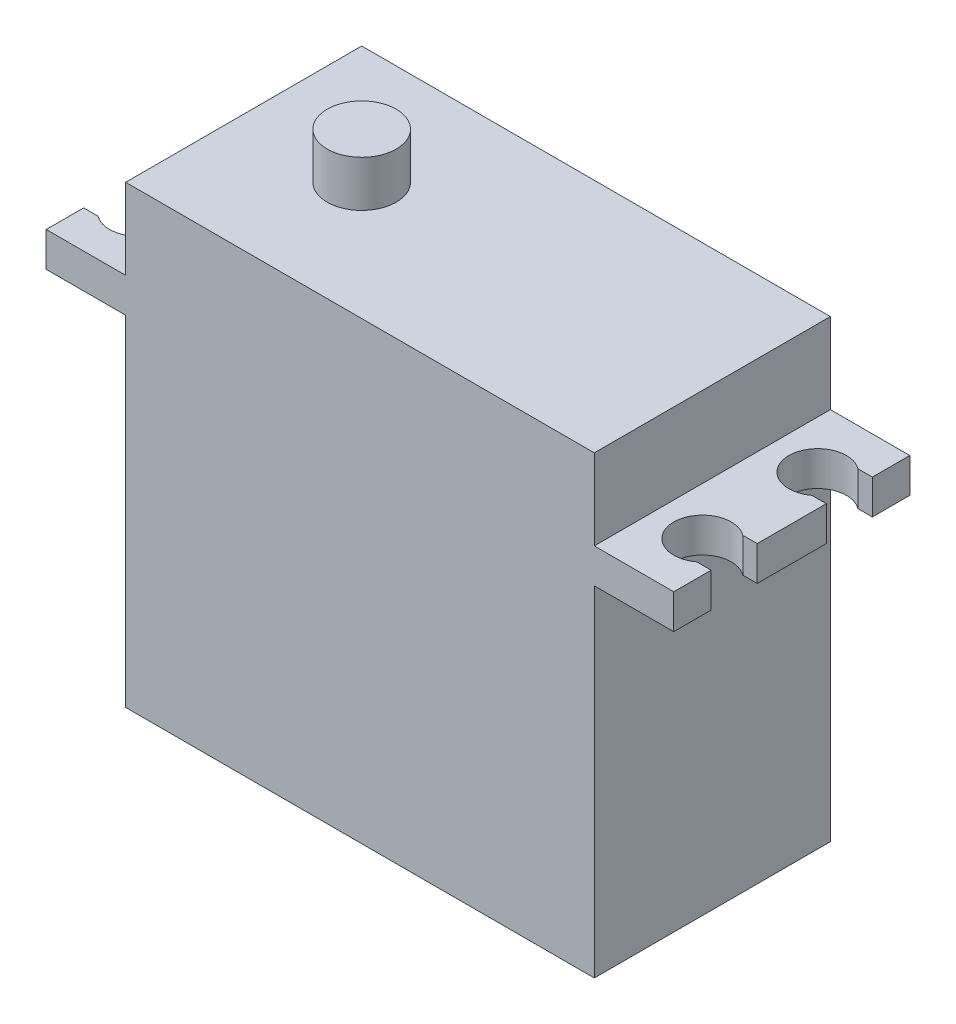
ISO-10303-21;
HEADER;
FILE_DESCRIPTION(('STEP AP214'),'2;1');
FILE_NAME('part.step','',(''),(''),'','','');
FILE_SCHEMA(('AUTOMOTIVE_DESIGN { 1 0 10303 214 1 1 1 1 }'));
ENDSEC;
DATA;
#1=APPLICATION_CONTEXT('core data for automotive mechanical design processes');
#2=APPLICATION_PROTOCOL_DEFINITION('international standard','automotive_design',2000,#1);
#3=PRODUCT_CONTEXT('',#1,'mechanical');
#4=PRODUCT('Part','Part','',(#3));
#5=PRODUCT_RELATED_PRODUCT_CATEGORY('part','',(#4));
#6=PRODUCT_DEFINITION_FORMATION('','',#4);
#7=PRODUCT_DEFINITION_CONTEXT('part definition',#1,'design');
#8=PRODUCT_DEFINITION('design','',#6,#7);
#9=PRODUCT_DEFINITION_SHAPE('','',#8);
#10=(LENGTH_UNIT() NAMED_UNIT(*) SI_UNIT(.MILLI.,.METRE.));
#11=(NAMED_UNIT(*) PLANE_ANGLE_UNIT() SI_UNIT($,.RADIAN.));
#12=(NAMED_UNIT(*) SI_UNIT($,.STERADIAN.) SOLID_ANGLE_UNIT());
#13=UNCERTAINTY_MEASURE_WITH_UNIT(LENGTH_MEASURE(1.E-05),#10,'distance_accuracy_value','');
#14=(GEOMETRIC_REPRESENTATION_CONTEXT(3) GLOBAL_UNCERTAINTY_ASSIGNED_CONTEXT((#13)) GLOBAL_UNIT_ASSIGNED_CONTEXT((#10,
#11,#12)) REPRESENTATION_CONTEXT('',''));
#15=CARTESIAN_POINT('',(0.,0.,0.));
#16=DIRECTION('',(0.,0.,1.));
#17=DIRECTION('',(1.,0.,0.));
#18=AXIS2_PLACEMENT_3D('',#15,#16,#17);
#19=CARTESIAN_POINT('',(47.6,32.5,-20.5));
#20=DIRECTION('',(-1.,0.,0.));
#21=DIRECTION('',(0.,0.,1.));
#22=AXIS2_PLACEMENT_3D('',#19,#20,#21);
#23=PLANE('',#22);
#24=DIRECTION('',(0.,0.,-1.));
#25=VECTOR('',#24,1.);
#26=CARTESIAN_POINT('',(47.6,29.5,-20.5));
#27=LINE('',#26,#25);
#28=CARTESIAN_POINT('',(47.6,29.5,-7.25000000000004));
#29=VERTEX_POINT('',#28);
#30=CARTESIAN_POINT('',(47.6,29.5,-13.25));
#31=VERTEX_POINT('',#30);
#32=EDGE_CURVE('E235',#29,#31,#27,.T.);
#33=ORIENTED_EDGE('',*,*,#32,.T.);
#34=DIRECTION('',(0.,-1.,0.));
#35=VECTOR('',#34,1.);
#36=CARTESIAN_POINT('',(47.6,43.5,-13.25));
#37=LINE('',#36,#35);
#38=CARTESIAN_POINT('',(47.6,32.5,-13.25));
#39=VERTEX_POINT('',#38);
#40=EDGE_CURVE('E219',#39,#31,#37,.T.);
#41=ORIENTED_EDGE('',*,*,#40,.F.);
#42=DIRECTION('',(0.,0.,-1.));
#43=VECTOR('',#42,1.);
#44=CARTESIAN_POINT('',(47.6,32.5,-20.5));
#45=LINE('',#44,#43);
#46=CARTESIAN_POINT('',(47.6,32.5,-7.25000000000004));
#47=VERTEX_POINT('',#46);
#48=EDGE_CURVE('E367',#47,#39,#45,.T.);
#49=ORIENTED_EDGE('',*,*,#48,.F.);
#50=DIRECTION('',(0.,-1.,0.));
#51=VECTOR('',#50,1.);
#52=CARTESIAN_POINT('',(47.6,43.5,-7.25000000000004));
#53=LINE('',#52,#51);
#54=EDGE_CURVE('E242',#47,#29,#53,.T.);
#55=ORIENTED_EDGE('',*,*,#54,.T.);
#56=EDGE_LOOP('',(#33,#41,#49,#55));
#57=FACE_BOUND('',#56,.T.);
#58=ADVANCED_FACE('F34',(#57),#23,.F.);
#59=CARTESIAN_POINT('',(47.6,32.5,-17.25));
#60=VERTEX_POINT('',#59);
#61=CARTESIAN_POINT('',(47.6,32.5,-20.5));
#62=VERTEX_POINT('',#61);
#63=EDGE_CURVE('E364',#60,#62,#45,.T.);
#64=ORIENTED_EDGE('',*,*,#63,.F.);
#65=DIRECTION('',(0.,-1.,0.));
#66=VECTOR('',#65,1.);
#67=CARTESIAN_POINT('',(47.6,43.5,-17.25));
#68=LINE('',#67,#66);
#69=CARTESIAN_POINT('',(47.6,29.5,-17.25));
#70=VERTEX_POINT('',#69);
#71=EDGE_CURVE('E228',#60,#70,#68,.T.);
#72=ORIENTED_EDGE('',*,*,#71,.T.);
#73=CARTESIAN_POINT('',(47.6,29.5,-20.5));
#74=VERTEX_POINT('',#73);
#75=EDGE_CURVE('E244',#70,#74,#27,.T.);
#76=ORIENTED_EDGE('',*,*,#75,.T.);
#77=DIRECTION('',(0.,-1.,0.));
#78=VECTOR('',#77,1.);
#79=CARTESIAN_POINT('',(47.6,32.5,-20.5));
#80=LINE('',#79,#78);
#81=EDGE_CURVE('E259',#62,#74,#80,.T.);
#82=ORIENTED_EDGE('',*,*,#81,.F.);
#83=EDGE_LOOP('',(#64,#72,#76,#82));
#84=FACE_BOUND('',#83,.T.);
#85=ADVANCED_FACE('F459',(#84),#23,.F.);
#86=DIRECTION('',(0.,-1.,0.));
#87=VECTOR('',#86,1.);
#88=CARTESIAN_POINT('',(47.6,43.5,-3.25000000000004));
#89=LINE('',#88,#87);
#90=CARTESIAN_POINT('',(47.6,32.5,-3.25000000000004));
#91=VERTEX_POINT('',#90);
#92=CARTESIAN_POINT('',(47.6,29.5,-3.25000000000004));
#93=VERTEX_POINT('',#92);
#94=EDGE_CURVE('E57',#91,#93,#89,.T.);
#95=ORIENTED_EDGE('',*,*,#94,.F.);
#96=CARTESIAN_POINT('',(47.6,32.5,0.));
#97=VERTEX_POINT('',#96);
#98=EDGE_CURVE('E369',#97,#91,#45,.T.);
#99=ORIENTED_EDGE('',*,*,#98,.F.);
#100=DIRECTION('',(0.,-1.,0.));
#101=VECTOR('',#100,1.);
#102=CARTESIAN_POINT('',(47.6,32.5,0.));
#103=LINE('',#102,#101);
#104=CARTESIAN_POINT('',(47.6,29.5,0.));
#105=VERTEX_POINT('',#104);
#106=EDGE_CURVE('E263',#97,#105,#103,.T.);
#107=ORIENTED_EDGE('',*,*,#106,.T.);
#108=EDGE_CURVE('E243',#105,#93,#27,.T.);
#109=ORIENTED_EDGE('',*,*,#108,.T.);
#110=EDGE_LOOP('',(#95,#99,#107,#109));
#111=FACE_BOUND('',#110,.T.);
#112=ADVANCED_FACE('F461',(#111),#23,.F.);
#113=CARTESIAN_POINT('',(0.,32.5,0.));
#114=DIRECTION('',(0.,1.,0.));
#115=DIRECTION('',(0.,0.,1.));
#116=AXIS2_PLACEMENT_3D('',#113,#114,#115);
#117=PLANE('',#116);
#118=DIRECTION('',(1.,0.,0.));
#119=VECTOR('',#118,1.);
#120=CARTESIAN_POINT('',(0.,32.5,-13.25));
#121=LINE('',#120,#119);
#122=CARTESIAN_POINT('',(46.35,32.5,-13.25));
#123=VERTEX_POINT('',#122);
#124=EDGE_CURVE('E222',#123,#39,#121,.T.);
#125=ORIENTED_EDGE('',*,*,#124,.F.);
#126=CARTESIAN_POINT('',(44.85,32.5,-15.25));
#127=DIRECTION('',(0.,1.,0.));
#128=DIRECTION('',(0.,0.,1.));
#129=AXIS2_PLACEMENT_3D('',#126,#127,#128);
#130=CIRCLE('',#129,2.5);
#131=CARTESIAN_POINT('',(46.35,32.5,-17.25));
#132=VERTEX_POINT('',#131);
#133=EDGE_CURVE('E227',#132,#123,#130,.T.);
#134=ORIENTED_EDGE('',*,*,#133,.F.);
#135=DIRECTION('',(-1.,0.,0.));
#136=VECTOR('',#135,1.);
#137=CARTESIAN_POINT('',(0.,32.5,-17.25));
#138=LINE('',#137,#136);
#139=EDGE_CURVE('E517',#60,#132,#138,.T.);
#140=ORIENTED_EDGE('',*,*,#139,.F.);
#141=ORIENTED_EDGE('',*,*,#63,.T.);
#142=DIRECTION('',(-1.,0.,0.));
#143=VECTOR('',#142,1.);
#144=CARTESIAN_POINT('',(-6.90000000000001,32.5,-20.5));
#145=LINE('',#144,#143);
#146=CARTESIAN_POINT('',(40.7,32.5,-20.5));
#147=VERTEX_POINT('',#146);
#148=EDGE_CURVE('E260',#62,#147,#145,.T.);
#149=ORIENTED_EDGE('',*,*,#148,.T.);
#150=DIRECTION('',(0.,0.,-1.));
#151=VECTOR('',#150,1.);
#152=CARTESIAN_POINT('',(40.7,32.5,0.));
#153=LINE('',#152,#151);
#154=CARTESIAN_POINT('',(40.7,32.5,0.));
#155=VERTEX_POINT('',#154);
#156=EDGE_CURVE('E275',#155,#147,#153,.T.);
#157=ORIENTED_EDGE('',*,*,#156,.F.);
#158=DIRECTION('',(1.,0.,0.));
#159=VECTOR('',#158,1.);
#160=CARTESIAN_POINT('',(-6.9,32.5,0.));
#161=LINE('',#160,#159);
#162=EDGE_CURVE('E365',#155,#97,#161,.T.);
#163=ORIENTED_EDGE('',*,*,#162,.T.);
#164=ORIENTED_EDGE('',*,*,#98,.T.);
#165=DIRECTION('',(-1.,0.,0.));
#166=VECTOR('',#165,1.);
#167=CARTESIAN_POINT('',(0.,32.5,-3.24999999999997));
#168=LINE('',#167,#166);
#169=CARTESIAN_POINT('',(46.35,32.5,-3.25000000000003));
#170=VERTEX_POINT('',#169);
#171=EDGE_CURVE('E481',#91,#170,#168,.T.);
#172=ORIENTED_EDGE('',*,*,#171,.T.);
#173=CARTESIAN_POINT('',(44.85,32.5,-5.25000000000003));
#174=DIRECTION('',(0.,1.,0.));
#175=DIRECTION('',(0.,0.,1.));
#176=AXIS2_PLACEMENT_3D('',#173,#174,#175);
#177=CIRCLE('',#176,2.5);
#178=CARTESIAN_POINT('',(46.35,32.5,-7.25000000000003));
#179=VERTEX_POINT('',#178);
#180=EDGE_CURVE('E441',#170,#179,#177,.F.);
#181=ORIENTED_EDGE('',*,*,#180,.T.);
#182=DIRECTION('',(1.,0.,0.));
#183=VECTOR('',#182,1.);
#184=CARTESIAN_POINT('',(0.,32.5,-7.24999999999997));
#185=LINE('',#184,#183);
#186=EDGE_CURVE('E437',#179,#47,#185,.T.);
#187=ORIENTED_EDGE('',*,*,#186,.T.);
#188=ORIENTED_EDGE('',*,*,#48,.T.);
#189=EDGE_LOOP('',(#125,#134,#140,#141,#149,#157,#163,#164,#172,#181,#187,#188));
#190=FACE_BOUND('',#189,.T.);
#191=ADVANCED_FACE('F469',(#190),#117,.T.);
#192=CARTESIAN_POINT('',(0.,29.5,0.));
#193=DIRECTION('',(0.,1.,0.));
#194=DIRECTION('',(0.,0.,1.));
#195=AXIS2_PLACEMENT_3D('',#192,#193,#194);
#196=PLANE('',#195);
#197=CARTESIAN_POINT('',(44.85,29.5,-15.25));
#198=DIRECTION('',(0.,-1.,0.));
#199=DIRECTION('',(0.,0.,1.));
#200=AXIS2_PLACEMENT_3D('',#197,#198,#199);
#201=CIRCLE('',#200,2.5);
#202=CARTESIAN_POINT('',(46.35,29.5,-13.25));
#203=VERTEX_POINT('',#202);
#204=CARTESIAN_POINT('',(46.35,29.5,-17.25));
#205=VERTEX_POINT('',#204);
#206=EDGE_CURVE('E238',#203,#205,#201,.T.);
#207=ORIENTED_EDGE('',*,*,#206,.F.);
#208=DIRECTION('',(-1.,0.,0.));
#209=VECTOR('',#208,1.);
#210=CARTESIAN_POINT('',(47.6,29.5,-13.25));
#211=LINE('',#210,#209);
#212=EDGE_CURVE('E49',#31,#203,#211,.T.);
#213=ORIENTED_EDGE('',*,*,#212,.F.);
#214=ORIENTED_EDGE('',*,*,#32,.F.);
#215=DIRECTION('',(-1.,0.,0.));
#216=VECTOR('',#215,1.);
#217=CARTESIAN_POINT('',(47.6,29.5,-7.25000000000004));
#218=LINE('',#217,#216);
#219=CARTESIAN_POINT('',(46.35,29.5,-7.25000000000003));
#220=VERTEX_POINT('',#219);
#221=EDGE_CURVE('E491',#29,#220,#218,.T.);
#222=ORIENTED_EDGE('',*,*,#221,.T.);
#223=CARTESIAN_POINT('',(44.85,29.5,-5.25000000000003));
#224=DIRECTION('',(0.,1.,0.));
#225=DIRECTION('',(0.,0.,-1.));
#226=AXIS2_PLACEMENT_3D('',#223,#224,#225);
#227=CIRCLE('',#226,2.5);
#228=CARTESIAN_POINT('',(46.35,29.5,-3.25000000000003));
#229=VERTEX_POINT('',#228);
#230=EDGE_CURVE('E487',#220,#229,#227,.T.);
#231=ORIENTED_EDGE('',*,*,#230,.T.);
#232=DIRECTION('',(1.,0.,0.));
#233=VECTOR('',#232,1.);
#234=CARTESIAN_POINT('',(46.35,29.5,-3.25000000000003));
#235=LINE('',#234,#233);
#236=EDGE_CURVE('E485',#229,#93,#235,.T.);
#237=ORIENTED_EDGE('',*,*,#236,.T.);
#238=ORIENTED_EDGE('',*,*,#108,.F.);
#239=DIRECTION('',(1.,0.,0.));
#240=VECTOR('',#239,1.);
#241=CARTESIAN_POINT('',(-6.9,29.5,0.));
#242=LINE('',#241,#240);
#243=CARTESIAN_POINT('',(40.7,29.5,0.));
#244=VERTEX_POINT('',#243);
#245=EDGE_CURVE('E348',#244,#105,#242,.T.);
#246=ORIENTED_EDGE('',*,*,#245,.F.);
#247=DIRECTION('',(0.,0.,-1.));
#248=VECTOR('',#247,1.);
#249=CARTESIAN_POINT('',(40.7,29.5,0.));
#250=LINE('',#249,#248);
#251=CARTESIAN_POINT('',(40.7,29.5,-20.5));
#252=VERTEX_POINT('',#251);
#253=EDGE_CURVE('E269',#244,#252,#250,.T.);
#254=ORIENTED_EDGE('',*,*,#253,.T.);
#255=DIRECTION('',(-1.,0.,0.));
#256=VECTOR('',#255,1.);
#257=CARTESIAN_POINT('',(-6.90000000000001,29.5,-20.5));
#258=LINE('',#257,#256);
#259=EDGE_CURVE('E252',#74,#252,#258,.T.);
#260=ORIENTED_EDGE('',*,*,#259,.F.);
#261=ORIENTED_EDGE('',*,*,#75,.F.);
#262=DIRECTION('',(1.,0.,0.));
#263=VECTOR('',#262,1.);
#264=CARTESIAN_POINT('',(46.35,29.5,-17.25));
#265=LINE('',#264,#263);
#266=EDGE_CURVE('E239',#205,#70,#265,.T.);
#267=ORIENTED_EDGE('',*,*,#266,.F.);
#268=EDGE_LOOP('',(#207,#213,#214,#222,#231,#237,#238,#246,#254,#260,#261,#267));
#269=FACE_BOUND('',#268,.T.);
#270=ADVANCED_FACE('F233',(#269),#196,.F.);
#271=CARTESIAN_POINT('',(-6.90000000000001,32.5,-20.5));
#272=DIRECTION('',(1.,0.,0.));
#273=DIRECTION('',(0.,0.,-1.));
#274=AXIS2_PLACEMENT_3D('',#271,#272,#273);
#275=PLANE('',#274);
#276=DIRECTION('',(0.,0.,1.));
#277=VECTOR('',#276,1.);
#278=CARTESIAN_POINT('',(-6.90000000000001,29.5,-20.5));
#279=LINE('',#278,#277);
#280=CARTESIAN_POINT('',(-6.90000000000001,29.5,-13.25));
#281=VERTEX_POINT('',#280);
#282=CARTESIAN_POINT('',(-6.90000000000001,29.5,-7.25));
#283=VERTEX_POINT('',#282);
#284=EDGE_CURVE('E339',#281,#283,#279,.T.);
#285=ORIENTED_EDGE('',*,*,#284,.T.);
#286=DIRECTION('',(0.,1.,0.));
#287=VECTOR('',#286,1.);
#288=CARTESIAN_POINT('',(-6.90000000000001,32.5,-7.25));
#289=LINE('',#288,#287);
#290=CARTESIAN_POINT('',(-6.90000000000001,32.5,-7.25));
#291=VERTEX_POINT('',#290);
#292=EDGE_CURVE('E12',#283,#291,#289,.T.);
#293=ORIENTED_EDGE('',*,*,#292,.T.);
#294=DIRECTION('',(0.,0.,1.));
#295=VECTOR('',#294,1.);
#296=CARTESIAN_POINT('',(-6.90000000000001,32.5,-20.5));
#297=LINE('',#296,#295);
#298=CARTESIAN_POINT('',(-6.90000000000001,32.5,-13.25));
#299=VERTEX_POINT('',#298);
#300=EDGE_CURVE('E391',#299,#291,#297,.T.);
#301=ORIENTED_EDGE('',*,*,#300,.F.);
#302=DIRECTION('',(0.,1.,0.));
#303=VECTOR('',#302,1.);
#304=CARTESIAN_POINT('',(-6.90000000000001,32.5,-13.25));
#305=LINE('',#304,#303);
#306=EDGE_CURVE('E322',#281,#299,#305,.T.);
#307=ORIENTED_EDGE('',*,*,#306,.F.);
#308=EDGE_LOOP('',(#285,#293,#301,#307));
#309=FACE_BOUND('',#308,.T.);
#310=ADVANCED_FACE('F427',(#309),#275,.F.);
#311=DIRECTION('',(-1.,0.,0.));
#312=VECTOR('',#311,1.);
#313=CARTESIAN_POINT('',(0.,32.5,-7.25));
#314=LINE('',#313,#312);
#315=CARTESIAN_POINT('',(-5.65000000000002,32.5,-7.25));
#316=VERTEX_POINT('',#315);
#317=EDGE_CURVE('E397',#316,#291,#314,.T.);
#318=ORIENTED_EDGE('',*,*,#317,.F.);
#319=CARTESIAN_POINT('',(-4.15000000000001,32.5,-5.25));
#320=DIRECTION('',(0.,1.,0.));
#321=DIRECTION('',(0.,0.,1.));
#322=AXIS2_PLACEMENT_3D('',#319,#320,#321);
#323=CIRCLE('',#322,2.5);
#324=CARTESIAN_POINT('',(-5.65000000000001,32.5,-3.25));
#325=VERTEX_POINT('',#324);
#326=EDGE_CURVE('E395',#325,#316,#323,.T.);
#327=ORIENTED_EDGE('',*,*,#326,.F.);
#328=DIRECTION('',(1.,0.,0.));
#329=VECTOR('',#328,1.);
#330=CARTESIAN_POINT('',(0.,32.5,-3.25));
#331=LINE('',#330,#329);
#332=CARTESIAN_POINT('',(-6.90000000000001,32.5,-3.25));
#333=VERTEX_POINT('',#332);
#334=EDGE_CURVE('E394',#333,#325,#331,.T.);
#335=ORIENTED_EDGE('',*,*,#334,.F.);
#336=CARTESIAN_POINT('',(-6.9,32.5,0.));
#337=VERTEX_POINT('',#336);
#338=EDGE_CURVE('E255',#333,#337,#297,.T.);
#339=ORIENTED_EDGE('',*,*,#338,.T.);
#340=CARTESIAN_POINT('',(0.,32.5,0.));
#341=VERTEX_POINT('',#340);
#342=EDGE_CURVE('E360',#337,#341,#161,.T.);
#343=ORIENTED_EDGE('',*,*,#342,.T.);
#344=DIRECTION('',(0.,0.,1.));
#345=VECTOR('',#344,1.);
#346=CARTESIAN_POINT('',(0.,32.5,0.));
#347=LINE('',#346,#345);
#348=CARTESIAN_POINT('',(0.,32.5,-20.5));
#349=VERTEX_POINT('',#348);
#350=EDGE_CURVE('E277',#349,#341,#347,.T.);
#351=ORIENTED_EDGE('',*,*,#350,.F.);
#352=CARTESIAN_POINT('',(-6.90000000000001,32.5,-20.5));
#353=VERTEX_POINT('',#352);
#354=EDGE_CURVE('E373',#349,#353,#145,.T.);
#355=ORIENTED_EDGE('',*,*,#354,.T.);
#356=CARTESIAN_POINT('',(-6.90000000000001,32.5,-17.25));
#357=VERTEX_POINT('',#356);
#358=EDGE_CURVE('E370',#353,#357,#297,.T.);
#359=ORIENTED_EDGE('',*,*,#358,.T.);
#360=DIRECTION('',(1.,0.,0.));
#361=VECTOR('',#360,1.);
#362=CARTESIAN_POINT('',(0.,32.5,-17.25));
#363=LINE('',#362,#361);
#364=CARTESIAN_POINT('',(-5.65000000000001,32.5,-17.25));
#365=VERTEX_POINT('',#364);
#366=EDGE_CURVE('E419',#357,#365,#363,.T.);
#367=ORIENTED_EDGE('',*,*,#366,.T.);
#368=CARTESIAN_POINT('',(-4.15000000000001,32.5,-15.25));
#369=DIRECTION('',(0.,1.,0.));
#370=DIRECTION('',(0.,0.,1.));
#371=AXIS2_PLACEMENT_3D('',#368,#369,#370);
#372=CIRCLE('',#371,2.5);
#373=CARTESIAN_POINT('',(-5.65000000000002,32.5,-13.25));
#374=VERTEX_POINT('',#373);
#375=EDGE_CURVE('E340',#365,#374,#372,.F.);
#376=ORIENTED_EDGE('',*,*,#375,.T.);
#377=DIRECTION('',(-1.,0.,0.));
#378=VECTOR('',#377,1.);
#379=CARTESIAN_POINT('',(0.,32.5,-13.25));
#380=LINE('',#379,#378);
#381=EDGE_CURVE('E344',#374,#299,#380,.T.);
#382=ORIENTED_EDGE('',*,*,#381,.T.);
#383=ORIENTED_EDGE('',*,*,#300,.T.);
#384=EDGE_LOOP('',(#318,#327,#335,#339,#343,#351,#355,#359,#367,#376,#382,#383));
#385=FACE_BOUND('',#384,.T.);
#386=ADVANCED_FACE('F382',(#385),#117,.T.);
#387=CARTESIAN_POINT('',(-4.15000000000001,29.5,-5.25));
#388=DIRECTION('',(0.,-1.,0.));
#389=DIRECTION('',(0.,0.,-1.));
#390=AXIS2_PLACEMENT_3D('',#387,#388,#389);
#391=CIRCLE('',#390,2.5);
#392=CARTESIAN_POINT('',(-5.65000000000002,29.5,-7.25));
#393=VERTEX_POINT('',#392);
#394=CARTESIAN_POINT('',(-5.65000000000001,29.5,-3.25));
#395=VERTEX_POINT('',#394);
#396=EDGE_CURVE('E436',#393,#395,#391,.T.);
#397=ORIENTED_EDGE('',*,*,#396,.F.);
#398=DIRECTION('',(1.,0.,0.));
#399=VECTOR('',#398,1.);
#400=CARTESIAN_POINT('',(-6.90000000000001,29.5,-7.25));
#401=LINE('',#400,#399);
#402=EDGE_CURVE('E434',#283,#393,#401,.T.);
#403=ORIENTED_EDGE('',*,*,#402,.F.);
#404=ORIENTED_EDGE('',*,*,#284,.F.);
#405=DIRECTION('',(1.,0.,0.));
#406=VECTOR('',#405,1.);
#407=CARTESIAN_POINT('',(-6.90000000000001,29.5,-13.25));
#408=LINE('',#407,#406);
#409=CARTESIAN_POINT('',(-5.65000000000002,29.5,-13.25));
#410=VERTEX_POINT('',#409);
#411=EDGE_CURVE('E406',#281,#410,#408,.T.);
#412=ORIENTED_EDGE('',*,*,#411,.T.);
#413=CARTESIAN_POINT('',(-4.15000000000001,29.5,-15.25));
#414=DIRECTION('',(0.,1.,0.));
#415=DIRECTION('',(0.,0.,1.));
#416=AXIS2_PLACEMENT_3D('',#413,#414,#415);
#417=CIRCLE('',#416,2.5);
#418=CARTESIAN_POINT('',(-5.65000000000001,29.5,-17.25));
#419=VERTEX_POINT('',#418);
#420=EDGE_CURVE('E409',#410,#419,#417,.T.);
#421=ORIENTED_EDGE('',*,*,#420,.T.);
#422=DIRECTION('',(-1.,0.,0.));
#423=VECTOR('',#422,1.);
#424=CARTESIAN_POINT('',(-5.65000000000001,29.5,-17.25));
#425=LINE('',#424,#423);
#426=CARTESIAN_POINT('',(-6.90000000000001,29.5,-17.25));
#427=VERTEX_POINT('',#426);
#428=EDGE_CURVE('E412',#419,#427,#425,.T.);
#429=ORIENTED_EDGE('',*,*,#428,.T.);
#430=CARTESIAN_POINT('',(-6.90000000000001,29.5,-20.5));
#431=VERTEX_POINT('',#430);
#432=EDGE_CURVE('E341',#431,#427,#279,.T.);
#433=ORIENTED_EDGE('',*,*,#432,.F.);
#434=CARTESIAN_POINT('',(0.,29.5,-20.5));
#435=VERTEX_POINT('',#434);
#436=EDGE_CURVE('E247',#435,#431,#258,.T.);
#437=ORIENTED_EDGE('',*,*,#436,.F.);
#438=DIRECTION('',(0.,0.,1.));
#439=VECTOR('',#438,1.);
#440=CARTESIAN_POINT('',(0.,29.5,0.));
#441=LINE('',#440,#439);
#442=CARTESIAN_POINT('',(0.,29.5,0.));
#443=VERTEX_POINT('',#442);
#444=EDGE_CURVE('E272',#435,#443,#441,.T.);
#445=ORIENTED_EDGE('',*,*,#444,.T.);
#446=CARTESIAN_POINT('',(-6.9,29.5,0.));
#447=VERTEX_POINT('',#446);
#448=EDGE_CURVE('E248',#447,#443,#242,.T.);
#449=ORIENTED_EDGE('',*,*,#448,.F.);
#450=CARTESIAN_POINT('',(-6.90000000000001,29.5,-3.25));
#451=VERTEX_POINT('',#450);
#452=EDGE_CURVE('E329',#451,#447,#279,.T.);
#453=ORIENTED_EDGE('',*,*,#452,.F.);
#454=DIRECTION('',(-1.,0.,0.));
#455=VECTOR('',#454,1.);
#456=CARTESIAN_POINT('',(-5.65000000000001,29.5,-3.25));
#457=LINE('',#456,#455);
#458=EDGE_CURVE('E337',#395,#451,#457,.T.);
#459=ORIENTED_EDGE('',*,*,#458,.F.);
#460=EDGE_LOOP('',(#397,#403,#404,#412,#421,#429,#433,#437,#445,#449,#453,#459));
#461=FACE_BOUND('',#460,.T.);
#462=ADVANCED_FACE('F336',(#461),#196,.F.);
#463=ORIENTED_EDGE('',*,*,#338,.F.);
#464=DIRECTION('',(0.,-1.,0.));
#465=VECTOR('',#464,1.);
#466=CARTESIAN_POINT('',(-6.90000000000001,32.5,-3.25));
#467=LINE('',#466,#465);
#468=EDGE_CURVE('E42',#333,#451,#467,.T.);
#469=ORIENTED_EDGE('',*,*,#468,.T.);
#470=ORIENTED_EDGE('',*,*,#452,.T.);
#471=DIRECTION('',(0.,-1.,0.));
#472=VECTOR('',#471,1.);
#473=CARTESIAN_POINT('',(-6.9,32.5,0.));
#474=LINE('',#473,#472);
#475=EDGE_CURVE('E266',#337,#447,#474,.T.);
#476=ORIENTED_EDGE('',*,*,#475,.F.);
#477=EDGE_LOOP('',(#463,#469,#470,#476));
#478=FACE_BOUND('',#477,.T.);
#479=ADVANCED_FACE('F327',(#478),#275,.F.);
#480=DIRECTION('',(0.,-1.,0.));
#481=VECTOR('',#480,1.);
#482=CARTESIAN_POINT('',(-6.90000000000001,32.5,-17.25));
#483=LINE('',#482,#481);
#484=EDGE_CURVE('E320',#357,#427,#483,.T.);
#485=ORIENTED_EDGE('',*,*,#484,.F.);
#486=ORIENTED_EDGE('',*,*,#358,.F.);
#487=DIRECTION('',(0.,-1.,0.));
#488=VECTOR('',#487,1.);
#489=CARTESIAN_POINT('',(-6.90000000000001,32.5,-20.5));
#490=LINE('',#489,#488);
#491=EDGE_CURVE('E256',#353,#431,#490,.T.);
#492=ORIENTED_EDGE('',*,*,#491,.T.);
#493=ORIENTED_EDGE('',*,*,#432,.T.);
#494=EDGE_LOOP('',(#485,#486,#492,#493));
#495=FACE_BOUND('',#494,.T.);
#496=ADVANCED_FACE('F390',(#495),#275,.F.);
#497=CARTESIAN_POINT('',(0.,39.5,0.));
#498=DIRECTION('',(1.,0.,0.));
#499=DIRECTION('',(0.,0.,-1.));
#500=AXIS2_PLACEMENT_3D('',#497,#498,#499);
#501=PLANE('',#500);
#502=ORIENTED_EDGE('',*,*,#444,.F.);
#503=DIRECTION('',(0.,-1.,0.));
#504=VECTOR('',#503,1.);
#505=CARTESIAN_POINT('',(0.,39.5,-20.5));
#506=LINE('',#505,#504);
#507=CARTESIAN_POINT('',(0.,0.,-20.5));
#508=VERTEX_POINT('',#507);
#509=EDGE_CURVE('E293',#435,#508,#506,.T.);
#510=ORIENTED_EDGE('',*,*,#509,.T.);
#511=DIRECTION('',(0.,0.,1.));
#512=VECTOR('',#511,1.);
#513=CARTESIAN_POINT('',(0.,0.,0.));
#514=LINE('',#513,#512);
#515=CARTESIAN_POINT('',(0.,0.,0.));
#516=VERTEX_POINT('',#515);
#517=EDGE_CURVE('E282',#508,#516,#514,.T.);
#518=ORIENTED_EDGE('',*,*,#517,.T.);
#519=DIRECTION('',(0.,-1.,0.));
#520=VECTOR('',#519,1.);
#521=CARTESIAN_POINT('',(0.,39.5,0.));
#522=LINE('',#521,#520);
#523=EDGE_CURVE('E313',#443,#516,#522,.T.);
#524=ORIENTED_EDGE('',*,*,#523,.F.);
#525=EDGE_LOOP('',(#502,#510,#518,#524));
#526=FACE_BOUND('',#525,.T.);
#527=ADVANCED_FACE('F547',(#526),#501,.F.);
#528=CARTESIAN_POINT('',(40.7,39.5,0.));
#529=DIRECTION('',(-1.,0.,0.));
#530=DIRECTION('',(0.,0.,1.));
#531=AXIS2_PLACEMENT_3D('',#528,#529,#530);
#532=PLANE('',#531);
#533=ORIENTED_EDGE('',*,*,#253,.F.);
#534=DIRECTION('',(0.,-1.,0.));
#535=VECTOR('',#534,1.);
#536=CARTESIAN_POINT('',(40.7,39.5,0.));
#537=LINE('',#536,#535);
#538=CARTESIAN_POINT('',(40.7,0.,0.));
#539=VERTEX_POINT('',#538);
#540=EDGE_CURVE('E310',#244,#539,#537,.T.);
#541=ORIENTED_EDGE('',*,*,#540,.T.);
#542=DIRECTION('',(0.,0.,-1.));
#543=VECTOR('',#542,1.);
#544=CARTESIAN_POINT('',(40.7,0.,0.));
#545=LINE('',#544,#543);
#546=CARTESIAN_POINT('',(40.7,0.,-20.5));
#547=VERTEX_POINT('',#546);
#548=EDGE_CURVE('E299',#539,#547,#545,.T.);
#549=ORIENTED_EDGE('',*,*,#548,.T.);
#550=DIRECTION('',(0.,-1.,0.));
#551=VECTOR('',#550,1.);
#552=CARTESIAN_POINT('',(40.7,39.5,-20.5));
#553=LINE('',#552,#551);
#554=EDGE_CURVE('E306',#252,#547,#553,.T.);
#555=ORIENTED_EDGE('',*,*,#554,.F.);
#556=EDGE_LOOP('',(#533,#541,#549,#555));
#557=FACE_BOUND('',#556,.T.);
#558=ADVANCED_FACE('F546',(#557),#532,.F.);
#559=CARTESIAN_POINT('',(0.,39.5,-20.5));
#560=VERTEX_POINT('',#559);
#561=EDGE_CURVE('E304',#560,#349,#506,.T.);
#562=ORIENTED_EDGE('',*,*,#561,.T.);
#563=ORIENTED_EDGE('',*,*,#350,.T.);
#564=CARTESIAN_POINT('',(0.,39.5,0.));
#565=VERTEX_POINT('',#564);
#566=EDGE_CURVE('E314',#565,#341,#522,.T.);
#567=ORIENTED_EDGE('',*,*,#566,.F.);
#568=DIRECTION('',(0.,0.,1.));
#569=VECTOR('',#568,1.);
#570=CARTESIAN_POINT('',(0.,39.5,0.));
#571=LINE('',#570,#569);
#572=EDGE_CURVE('E283',#560,#565,#571,.T.);
#573=ORIENTED_EDGE('',*,*,#572,.F.);
#574=EDGE_LOOP('',(#562,#563,#567,#573));
#575=FACE_BOUND('',#574,.T.);
#576=ADVANCED_FACE('F36',(#575),#501,.F.);
#577=CARTESIAN_POINT('',(0.,39.5,0.));
#578=DIRECTION('',(0.,0.,-1.));
#579=DIRECTION('',(-1.,0.,0.));
#580=AXIS2_PLACEMENT_3D('',#577,#578,#579);
#581=PLANE('',#580);
#582=ORIENTED_EDGE('',*,*,#566,.T.);
#583=ORIENTED_EDGE('',*,*,#342,.F.);
#584=ORIENTED_EDGE('',*,*,#475,.T.);
#585=ORIENTED_EDGE('',*,*,#448,.T.);
#586=ORIENTED_EDGE('',*,*,#523,.T.);
#587=DIRECTION('',(1.,0.,0.));
#588=VECTOR('',#587,1.);
#589=CARTESIAN_POINT('',(0.,0.,0.));
#590=LINE('',#589,#588);
#591=EDGE_CURVE('E296',#516,#539,#590,.T.);
#592=ORIENTED_EDGE('',*,*,#591,.T.);
#593=ORIENTED_EDGE('',*,*,#540,.F.);
#594=ORIENTED_EDGE('',*,*,#245,.T.);
#595=ORIENTED_EDGE('',*,*,#106,.F.);
#596=ORIENTED_EDGE('',*,*,#162,.F.);
#597=CARTESIAN_POINT('',(40.7,39.5,0.));
#598=VERTEX_POINT('',#597);
#599=EDGE_CURVE('E311',#598,#155,#537,.T.);
#600=ORIENTED_EDGE('',*,*,#599,.F.);
#601=DIRECTION('',(1.,0.,0.));
#602=VECTOR('',#601,1.);
#603=CARTESIAN_POINT('',(0.,39.5,0.));
#604=LINE('',#603,#602);
#605=EDGE_CURVE('E286',#565,#598,#604,.T.);
#606=ORIENTED_EDGE('',*,*,#605,.F.);
#607=EDGE_LOOP('',(#582,#583,#584,#585,#586,#592,#593,#594,#595,#596,#600,#606));
#608=FACE_BOUND('',#607,.T.);
#609=ADVANCED_FACE('F356',(#608),#581,.F.);
#610=ORIENTED_EDGE('',*,*,#599,.T.);
#611=ORIENTED_EDGE('',*,*,#156,.T.);
#612=CARTESIAN_POINT('',(40.7,39.5,-20.5));
#613=VERTEX_POINT('',#612);
#614=EDGE_CURVE('E307',#613,#147,#553,.T.);
#615=ORIENTED_EDGE('',*,*,#614,.F.);
#616=DIRECTION('',(0.,0.,-1.));
#617=VECTOR('',#616,1.);
#618=CARTESIAN_POINT('',(40.7,39.5,0.));
#619=LINE('',#618,#617);
#620=EDGE_CURVE('E289',#598,#613,#619,.T.);
#621=ORIENTED_EDGE('',*,*,#620,.F.);
#622=EDGE_LOOP('',(#610,#611,#615,#621));
#623=FACE_BOUND('',#622,.T.);
#624=ADVANCED_FACE('F540',(#623),#532,.F.);
#625=CARTESIAN_POINT('',(0.,39.5,-20.5));
#626=DIRECTION('',(0.,0.,1.));
#627=DIRECTION('',(1.,0.,0.));
#628=AXIS2_PLACEMENT_3D('',#625,#626,#627);
#629=PLANE('',#628);
#630=ORIENTED_EDGE('',*,*,#614,.T.);
#631=ORIENTED_EDGE('',*,*,#148,.F.);
#632=ORIENTED_EDGE('',*,*,#81,.T.);
#633=ORIENTED_EDGE('',*,*,#259,.T.);
#634=ORIENTED_EDGE('',*,*,#554,.T.);
#635=DIRECTION('',(-1.,0.,0.));
#636=VECTOR('',#635,1.);
#637=CARTESIAN_POINT('',(0.,0.,-20.5));
#638=LINE('',#637,#636);
#639=EDGE_CURVE('E287',#547,#508,#638,.T.);
#640=ORIENTED_EDGE('',*,*,#639,.T.);
#641=ORIENTED_EDGE('',*,*,#509,.F.);
#642=ORIENTED_EDGE('',*,*,#436,.T.);
#643=ORIENTED_EDGE('',*,*,#491,.F.);
#644=ORIENTED_EDGE('',*,*,#354,.F.);
#645=ORIENTED_EDGE('',*,*,#561,.F.);
#646=DIRECTION('',(-1.,0.,0.));
#647=VECTOR('',#646,1.);
#648=CARTESIAN_POINT('',(0.,39.5,-20.5));
#649=LINE('',#648,#647);
#650=EDGE_CURVE('E291',#613,#560,#649,.T.);
#651=ORIENTED_EDGE('',*,*,#650,.F.);
#652=EDGE_LOOP('',(#630,#631,#632,#633,#634,#640,#641,#642,#643,#644,#645,#651));
#653=FACE_BOUND('',#652,.T.);
#654=ADVANCED_FACE('F387',(#653),#629,.F.);
#655=CARTESIAN_POINT('',(0.,39.5,0.));
#656=DIRECTION('',(0.,-1.,0.));
#657=DIRECTION('',(0.,0.,-1.));
#658=AXIS2_PLACEMENT_3D('',#655,#656,#657);
#659=PLANE('',#658);
#660=CARTESIAN_POINT('',(10.25,39.5,-10.25));
#661=DIRECTION('',(0.,-1.,0.));
#662=DIRECTION('',(0.,0.,-1.));
#663=AXIS2_PLACEMENT_3D('',#660,#661,#662);
#664=CIRCLE('',#663,3.);
#665=CARTESIAN_POINT('',(10.25,39.5,-13.25));
#666=VERTEX_POINT('',#665);
#667=EDGE_CURVE('E317',#666,#666,#664,.F.);
#668=ORIENTED_EDGE('',*,*,#667,.F.);
#669=EDGE_LOOP('',(#668));
#670=FACE_BOUND('',#669,.T.);
#671=ORIENTED_EDGE('',*,*,#572,.T.);
#672=ORIENTED_EDGE('',*,*,#605,.T.);
#673=ORIENTED_EDGE('',*,*,#620,.T.);
#674=ORIENTED_EDGE('',*,*,#650,.T.);
#675=EDGE_LOOP('',(#671,#672,#673,#674));
#676=FACE_BOUND('',#675,.T.);
#677=ADVANCED_FACE('F543',(#670,#676),#659,.F.);
#678=CARTESIAN_POINT('',(0.,0.,0.));
#679=DIRECTION('',(0.,-1.,0.));
#680=DIRECTION('',(0.,0.,-1.));
#681=AXIS2_PLACEMENT_3D('',#678,#679,#680);
#682=PLANE('',#681);
#683=ORIENTED_EDGE('',*,*,#517,.F.);
#684=ORIENTED_EDGE('',*,*,#639,.F.);
#685=ORIENTED_EDGE('',*,*,#548,.F.);
#686=ORIENTED_EDGE('',*,*,#591,.F.);
#687=EDGE_LOOP('',(#683,#684,#685,#686));
#688=FACE_BOUND('',#687,.T.);
#689=ADVANCED_FACE('F594',(#688),#682,.T.);
#690=CARTESIAN_POINT('',(10.25,95.4852813742386,-10.25));
#691=DIRECTION('',(0.,-1.,0.));
#692=DIRECTION('',(0.,0.,-1.));
#693=AXIS2_PLACEMENT_3D('',#690,#691,#692);
#694=CYLINDRICAL_SURFACE('',#693,3.);
#695=CARTESIAN_POINT('',(10.25,43.5,-10.25));
#696=DIRECTION('',(0.,-1.,0.));
#697=DIRECTION('',(0.,0.,-1.));
#698=AXIS2_PLACEMENT_3D('',#695,#696,#697);
#699=CIRCLE('',#698,3.);
#700=CARTESIAN_POINT('',(10.25,43.5,-13.25));
#701=VERTEX_POINT('',#700);
#702=EDGE_CURVE('E279',#701,#701,#699,.T.);
#703=ORIENTED_EDGE('',*,*,#702,.T.);
#704=EDGE_LOOP('',(#703));
#705=FACE_BOUND('',#704,.T.);
#706=ORIENTED_EDGE('',*,*,#667,.T.);
#707=EDGE_LOOP('',(#706));
#708=FACE_BOUND('',#707,.T.);
#709=ADVANCED_FACE('F576',(#705,#708),#694,.T.);
#710=CARTESIAN_POINT('',(0.,43.5,0.));
#711=DIRECTION('',(0.,-1.,0.));
#712=DIRECTION('',(0.,0.,-1.));
#713=AXIS2_PLACEMENT_3D('',#710,#711,#712);
#714=PLANE('',#713);
#715=ORIENTED_EDGE('',*,*,#702,.F.);
#716=EDGE_LOOP('',(#715));
#717=FACE_BOUND('',#716,.T.);
#718=ADVANCED_FACE('F569',(#717),#714,.F.);
#719=CARTESIAN_POINT('',(-6.90000000000001,43.5,-13.25));
#720=DIRECTION('',(0.,0.,-1.));
#721=DIRECTION('',(-1.,0.,0.));
#722=AXIS2_PLACEMENT_3D('',#719,#720,#721);
#723=PLANE('',#722);
#724=DIRECTION('',(0.,-1.,0.));
#725=VECTOR('',#724,1.);
#726=CARTESIAN_POINT('',(-5.65000000000002,43.5,-13.25));
#727=LINE('',#726,#725);
#728=EDGE_CURVE('E417',#374,#410,#727,.T.);
#729=ORIENTED_EDGE('',*,*,#728,.T.);
#730=ORIENTED_EDGE('',*,*,#411,.F.);
#731=ORIENTED_EDGE('',*,*,#306,.T.);
#732=ORIENTED_EDGE('',*,*,#381,.F.);
#733=EDGE_LOOP('',(#729,#730,#731,#732));
#734=FACE_BOUND('',#733,.T.);
#735=ADVANCED_FACE('F567',(#734),#723,.T.);
#736=CARTESIAN_POINT('',(-4.15000000000001,43.5,-15.25));
#737=DIRECTION('',(0.,-1.,0.));
#738=DIRECTION('',(0.,0.,-1.));
#739=AXIS2_PLACEMENT_3D('',#736,#737,#738);
#740=CYLINDRICAL_SURFACE('',#739,2.5);
#741=DIRECTION('',(0.,-1.,0.));
#742=VECTOR('',#741,1.);
#743=CARTESIAN_POINT('',(-5.65000000000001,43.5,-17.25));
#744=LINE('',#743,#742);
#745=EDGE_CURVE('E415',#365,#419,#744,.T.);
#746=ORIENTED_EDGE('',*,*,#745,.T.);
#747=ORIENTED_EDGE('',*,*,#420,.F.);
#748=ORIENTED_EDGE('',*,*,#728,.F.);
#749=ORIENTED_EDGE('',*,*,#375,.F.);
#750=EDGE_LOOP('',(#746,#747,#748,#749));
#751=FACE_BOUND('',#750,.T.);
#752=ADVANCED_FACE('F566',(#751),#740,.F.);
#753=CARTESIAN_POINT('',(-5.65000000000001,43.5,-17.25));
#754=DIRECTION('',(0.,0.,1.));
#755=DIRECTION('',(1.,0.,0.));
#756=AXIS2_PLACEMENT_3D('',#753,#754,#755);
#757=PLANE('',#756);
#758=ORIENTED_EDGE('',*,*,#484,.T.);
#759=ORIENTED_EDGE('',*,*,#428,.F.);
#760=ORIENTED_EDGE('',*,*,#745,.F.);
#761=ORIENTED_EDGE('',*,*,#366,.F.);
#762=EDGE_LOOP('',(#758,#759,#760,#761));
#763=FACE_BOUND('',#762,.T.);
#764=ADVANCED_FACE('F456',(#763),#757,.T.);
#765=CARTESIAN_POINT('',(-6.90000000000001,43.5,-7.25));
#766=DIRECTION('',(0.,0.,-1.));
#767=DIRECTION('',(-1.,0.,0.));
#768=AXIS2_PLACEMENT_3D('',#765,#766,#767);
#769=PLANE('',#768);
#770=ORIENTED_EDGE('',*,*,#317,.T.);
#771=ORIENTED_EDGE('',*,*,#292,.F.);
#772=ORIENTED_EDGE('',*,*,#402,.T.);
#773=DIRECTION('',(0.,-1.,0.));
#774=VECTOR('',#773,1.);
#775=CARTESIAN_POINT('',(-5.65000000000002,43.5,-7.25));
#776=LINE('',#775,#774);
#777=EDGE_CURVE('E401',#316,#393,#776,.T.);
#778=ORIENTED_EDGE('',*,*,#777,.F.);
#779=EDGE_LOOP('',(#770,#771,#772,#778));
#780=FACE_BOUND('',#779,.T.);
#781=ADVANCED_FACE('F432',(#780),#769,.F.);
#782=CARTESIAN_POINT('',(-5.65000000000001,43.5,-3.25));
#783=DIRECTION('',(0.,0.,1.));
#784=DIRECTION('',(1.,0.,0.));
#785=AXIS2_PLACEMENT_3D('',#782,#783,#784);
#786=PLANE('',#785);
#787=ORIENTED_EDGE('',*,*,#334,.T.);
#788=DIRECTION('',(0.,-1.,0.));
#789=VECTOR('',#788,1.);
#790=CARTESIAN_POINT('',(-5.65000000000001,43.5,-3.25));
#791=LINE('',#790,#789);
#792=EDGE_CURVE('E398',#325,#395,#791,.T.);
#793=ORIENTED_EDGE('',*,*,#792,.T.);
#794=ORIENTED_EDGE('',*,*,#458,.T.);
#795=ORIENTED_EDGE('',*,*,#468,.F.);
#796=EDGE_LOOP('',(#787,#793,#794,#795));
#797=FACE_BOUND('',#796,.T.);
#798=ADVANCED_FACE('F447',(#797),#786,.F.);
#799=CARTESIAN_POINT('',(-4.15000000000001,43.5,-5.25));
#800=DIRECTION('',(0.,-1.,0.));
#801=DIRECTION('',(0.,0.,-1.));
#802=AXIS2_PLACEMENT_3D('',#799,#800,#801);
#803=CYLINDRICAL_SURFACE('',#802,2.5);
#804=ORIENTED_EDGE('',*,*,#326,.T.);
#805=ORIENTED_EDGE('',*,*,#777,.T.);
#806=ORIENTED_EDGE('',*,*,#396,.T.);
#807=ORIENTED_EDGE('',*,*,#792,.F.);
#808=EDGE_LOOP('',(#804,#805,#806,#807));
#809=FACE_BOUND('',#808,.T.);
#810=ADVANCED_FACE('F446',(#809),#803,.F.);
#811=CARTESIAN_POINT('',(47.6,43.5,-7.25000000000004));
#812=DIRECTION('',(0.,0.,1.));
#813=DIRECTION('',(1.,0.,0.));
#814=AXIS2_PLACEMENT_3D('',#811,#812,#813);
#815=PLANE('',#814);
#816=DIRECTION('',(0.,-1.,0.));
#817=VECTOR('',#816,1.);
#818=CARTESIAN_POINT('',(46.35,43.5,-7.25000000000003));
#819=LINE('',#818,#817);
#820=EDGE_CURVE('E496',#179,#220,#819,.T.);
#821=ORIENTED_EDGE('',*,*,#820,.T.);
#822=ORIENTED_EDGE('',*,*,#221,.F.);
#823=ORIENTED_EDGE('',*,*,#54,.F.);
#824=ORIENTED_EDGE('',*,*,#186,.F.);
#825=EDGE_LOOP('',(#821,#822,#823,#824));
#826=FACE_BOUND('',#825,.T.);
#827=ADVANCED_FACE('F454',(#826),#815,.T.);
#828=CARTESIAN_POINT('',(44.85,43.5,-5.25000000000003));
#829=DIRECTION('',(0.,-1.,0.));
#830=DIRECTION('',(0.,0.,-1.));
#831=AXIS2_PLACEMENT_3D('',#828,#829,#830);
#832=CYLINDRICAL_SURFACE('',#831,2.5);
#833=DIRECTION('',(0.,-1.,0.));
#834=VECTOR('',#833,1.);
#835=CARTESIAN_POINT('',(46.35,43.5,-3.25000000000003));
#836=LINE('',#835,#834);
#837=EDGE_CURVE('E477',#170,#229,#836,.T.);
#838=ORIENTED_EDGE('',*,*,#837,.T.);
#839=ORIENTED_EDGE('',*,*,#230,.F.);
#840=ORIENTED_EDGE('',*,*,#820,.F.);
#841=ORIENTED_EDGE('',*,*,#180,.F.);
#842=EDGE_LOOP('',(#838,#839,#840,#841));
#843=FACE_BOUND('',#842,.T.);
#844=ADVANCED_FACE('F500',(#843),#832,.F.);
#845=CARTESIAN_POINT('',(46.35,43.5,-3.25000000000003));
#846=DIRECTION('',(0.,0.,-1.));
#847=DIRECTION('',(-1.,0.,0.));
#848=AXIS2_PLACEMENT_3D('',#845,#846,#847);
#849=PLANE('',#848);
#850=ORIENTED_EDGE('',*,*,#94,.T.);
#851=ORIENTED_EDGE('',*,*,#236,.F.);
#852=ORIENTED_EDGE('',*,*,#837,.F.);
#853=ORIENTED_EDGE('',*,*,#171,.F.);
#854=EDGE_LOOP('',(#850,#851,#852,#853));
#855=FACE_BOUND('',#854,.T.);
#856=ADVANCED_FACE('F501',(#855),#849,.T.);
#857=CARTESIAN_POINT('',(47.6,43.5,-13.25));
#858=DIRECTION('',(0.,0.,1.));
#859=DIRECTION('',(1.,0.,0.));
#860=AXIS2_PLACEMENT_3D('',#857,#858,#859);
#861=PLANE('',#860);
#862=ORIENTED_EDGE('',*,*,#124,.T.);
#863=ORIENTED_EDGE('',*,*,#40,.T.);
#864=ORIENTED_EDGE('',*,*,#212,.T.);
#865=DIRECTION('',(0.,-1.,0.));
#866=VECTOR('',#865,1.);
#867=CARTESIAN_POINT('',(46.35,43.5,-13.25));
#868=LINE('',#867,#866);
#869=EDGE_CURVE('E526',#123,#203,#868,.T.);
#870=ORIENTED_EDGE('',*,*,#869,.F.);
#871=EDGE_LOOP('',(#862,#863,#864,#870));
#872=FACE_BOUND('',#871,.T.);
#873=ADVANCED_FACE('F220',(#872),#861,.F.);
#874=CARTESIAN_POINT('',(46.35,43.5,-17.25));
#875=DIRECTION('',(0.,0.,-1.));
#876=DIRECTION('',(-1.,0.,0.));
#877=AXIS2_PLACEMENT_3D('',#874,#875,#876);
#878=PLANE('',#877);
#879=ORIENTED_EDGE('',*,*,#139,.T.);
#880=DIRECTION('',(0.,-1.,0.));
#881=VECTOR('',#880,1.);
#882=CARTESIAN_POINT('',(46.35,43.5,-17.25));
#883=LINE('',#882,#881);
#884=EDGE_CURVE('E524',#132,#205,#883,.T.);
#885=ORIENTED_EDGE('',*,*,#884,.T.);
#886=ORIENTED_EDGE('',*,*,#266,.T.);
#887=ORIENTED_EDGE('',*,*,#71,.F.);
#888=EDGE_LOOP('',(#879,#885,#886,#887));
#889=FACE_BOUND('',#888,.T.);
#890=ADVANCED_FACE('F508',(#889),#878,.F.);
#891=CARTESIAN_POINT('',(44.85,43.5,-15.25));
#892=DIRECTION('',(0.,-1.,0.));
#893=DIRECTION('',(0.,0.,-1.));
#894=AXIS2_PLACEMENT_3D('',#891,#892,#893);
#895=CYLINDRICAL_SURFACE('',#894,2.5);
#896=ORIENTED_EDGE('',*,*,#133,.T.);
#897=ORIENTED_EDGE('',*,*,#869,.T.);
#898=ORIENTED_EDGE('',*,*,#206,.T.);
#899=ORIENTED_EDGE('',*,*,#884,.F.);
#900=EDGE_LOOP('',(#896,#897,#898,#899));
#901=FACE_BOUND('',#900,.T.);
#902=ADVANCED_FACE('F756',(#901),#895,.F.);
#903=CLOSED_SHELL('',(#58,#85,#112,#191,#270,#310,#386,#462,#479,#496,#527,#558,#576,#609,#624,
#654,#677,#689,#709,#718,#735,#752,#764,#781,#798,#810,#827,#844,#856,#873,#890,#902));
#904=MANIFOLD_SOLID_BREP('B2',#903);
#905=ADVANCED_BREP_SHAPE_REPRESENTATION('',(#18,#904),#14);
#906=SHAPE_DEFINITION_REPRESENTATION(#9,#905);
ENDSEC;
END-ISO-10303-21;
